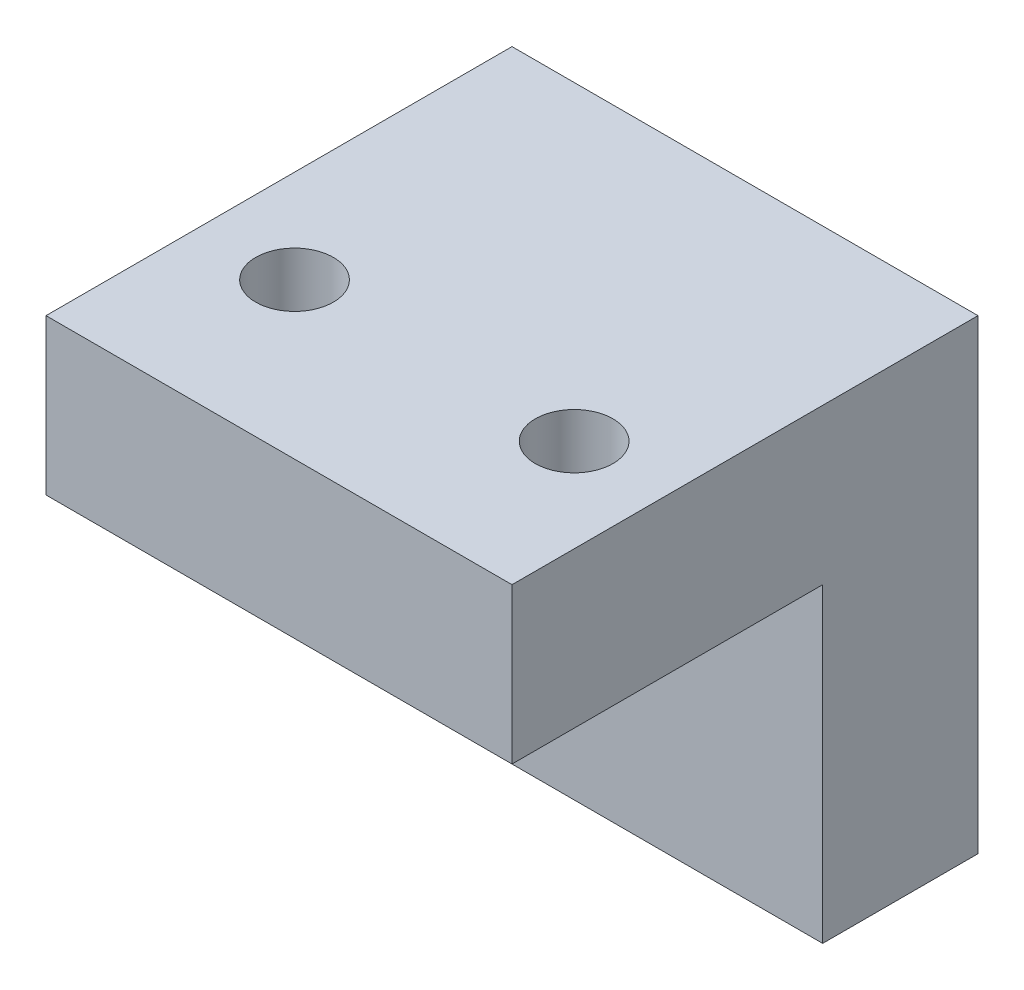
ISO-10303-21;
HEADER;
FILE_DESCRIPTION(('STEP AP214'),'2;1');
FILE_NAME('part.step','',(''),(''),'','','');
FILE_SCHEMA(('AUTOMOTIVE_DESIGN { 1 0 10303 214 1 1 1 1 }'));
ENDSEC;
DATA;
#1=APPLICATION_CONTEXT('core data for automotive mechanical design processes');
#2=APPLICATION_PROTOCOL_DEFINITION('international standard','automotive_design',2000,#1);
#3=PRODUCT_CONTEXT('',#1,'mechanical');
#4=PRODUCT('Part','Part','',(#3));
#5=PRODUCT_RELATED_PRODUCT_CATEGORY('part','',(#4));
#6=PRODUCT_DEFINITION_FORMATION('','',#4);
#7=PRODUCT_DEFINITION_CONTEXT('part definition',#1,'design');
#8=PRODUCT_DEFINITION('design','',#6,#7);
#9=PRODUCT_DEFINITION_SHAPE('','',#8);
#10=(LENGTH_UNIT() NAMED_UNIT(*) SI_UNIT(.MILLI.,.METRE.));
#11=(NAMED_UNIT(*) PLANE_ANGLE_UNIT() SI_UNIT($,.RADIAN.));
#12=(NAMED_UNIT(*) SI_UNIT($,.STERADIAN.) SOLID_ANGLE_UNIT());
#13=UNCERTAINTY_MEASURE_WITH_UNIT(LENGTH_MEASURE(1.E-05),#10,'distance_accuracy_value','');
#14=(GEOMETRIC_REPRESENTATION_CONTEXT(3) GLOBAL_UNCERTAINTY_ASSIGNED_CONTEXT((#13)) GLOBAL_UNIT_ASSIGNED_CONTEXT((#10,
#11,#12)) REPRESENTATION_CONTEXT('',''));
#15=CARTESIAN_POINT('',(0.,0.,0.));
#16=DIRECTION('',(0.,0.,1.));
#17=DIRECTION('',(1.,0.,0.));
#18=AXIS2_PLACEMENT_3D('',#15,#16,#17);
#19=CARTESIAN_POINT('',(0.,10.,0.));
#20=DIRECTION('',(1.,0.,0.));
#21=DIRECTION('',(0.,0.,-1.));
#22=AXIS2_PLACEMENT_3D('',#19,#20,#21);
#23=PLANE('',#22);
#24=DIRECTION('',(0.,0.,1.));
#25=VECTOR('',#24,1.);
#26=CARTESIAN_POINT('',(0.,0.,0.));
#27=LINE('',#26,#25);
#28=CARTESIAN_POINT('',(0.,0.,-5.));
#29=VERTEX_POINT('',#28);
#30=CARTESIAN_POINT('',(0.,0.,0.));
#31=VERTEX_POINT('',#30);
#32=EDGE_CURVE('E98',#29,#31,#27,.T.);
#33=ORIENTED_EDGE('',*,*,#32,.T.);
#34=DIRECTION('',(0.,-1.,0.));
#35=VECTOR('',#34,1.);
#36=CARTESIAN_POINT('',(0.,10.,0.));
#37=LINE('',#36,#35);
#38=CARTESIAN_POINT('',(0.,10.,0.));
#39=VERTEX_POINT('',#38);
#40=EDGE_CURVE('E11',#39,#31,#37,.T.);
#41=ORIENTED_EDGE('',*,*,#40,.F.);
#42=DIRECTION('',(0.,0.,1.));
#43=VECTOR('',#42,1.);
#44=CARTESIAN_POINT('',(0.,10.,-5.));
#45=LINE('',#44,#43);
#46=CARTESIAN_POINT('',(0.,10.,10.));
#47=VERTEX_POINT('',#46);
#48=EDGE_CURVE('E123',#39,#47,#45,.T.);
#49=ORIENTED_EDGE('',*,*,#48,.T.);
#50=DIRECTION('',(0.,-1.,0.));
#51=VECTOR('',#50,1.);
#52=CARTESIAN_POINT('',(0.,15.,10.));
#53=LINE('',#52,#51);
#54=CARTESIAN_POINT('',(0.,15.,10.));
#55=VERTEX_POINT('',#54);
#56=EDGE_CURVE('E118',#55,#47,#53,.T.);
#57=ORIENTED_EDGE('',*,*,#56,.F.);
#58=DIRECTION('',(0.,0.,1.));
#59=VECTOR('',#58,1.);
#60=CARTESIAN_POINT('',(0.,15.,-5.));
#61=LINE('',#60,#59);
#62=CARTESIAN_POINT('',(0.,15.,-5.));
#63=VERTEX_POINT('',#62);
#64=EDGE_CURVE('E107',#63,#55,#61,.T.);
#65=ORIENTED_EDGE('',*,*,#64,.F.);
#66=DIRECTION('',(0.,-1.,0.));
#67=VECTOR('',#66,1.);
#68=CARTESIAN_POINT('',(0.,10.,-5.));
#69=LINE('',#68,#67);
#70=EDGE_CURVE('E91',#63,#29,#69,.T.);
#71=ORIENTED_EDGE('',*,*,#70,.T.);
#72=EDGE_LOOP('',(#33,#41,#49,#57,#65,#71));
#73=FACE_BOUND('',#72,.T.);
#74=ADVANCED_FACE('F41',(#73),#23,.F.);
#75=CARTESIAN_POINT('',(0.,10.,0.));
#76=DIRECTION('',(0.,0.,-1.));
#77=DIRECTION('',(-1.,0.,0.));
#78=AXIS2_PLACEMENT_3D('',#75,#76,#77);
#79=PLANE('',#78);
#80=CARTESIAN_POINT('',(7.5,5.,0.));
#81=DIRECTION('',(0.,0.,1.));
#82=DIRECTION('',(1.,0.,0.));
#83=AXIS2_PLACEMENT_3D('',#80,#81,#82);
#84=CIRCLE('',#83,1.25);
#85=CARTESIAN_POINT('',(8.75,5.,0.));
#86=VERTEX_POINT('',#85);
#87=EDGE_CURVE('E152',#86,#86,#84,.T.);
#88=ORIENTED_EDGE('',*,*,#87,.F.);
#89=EDGE_LOOP('',(#88));
#90=FACE_BOUND('',#89,.T.);
#91=DIRECTION('',(1.,0.,0.));
#92=VECTOR('',#91,1.);
#93=CARTESIAN_POINT('',(0.,0.,0.));
#94=LINE('',#93,#92);
#95=CARTESIAN_POINT('',(15.,0.,0.));
#96=VERTEX_POINT('',#95);
#97=EDGE_CURVE('E83',#31,#96,#94,.T.);
#98=ORIENTED_EDGE('',*,*,#97,.T.);
#99=DIRECTION('',(0.,-1.,0.));
#100=VECTOR('',#99,1.);
#101=CARTESIAN_POINT('',(15.,10.,0.));
#102=LINE('',#101,#100);
#103=CARTESIAN_POINT('',(15.,10.,0.));
#104=VERTEX_POINT('',#103);
#105=EDGE_CURVE('E47',#104,#96,#102,.T.);
#106=ORIENTED_EDGE('',*,*,#105,.F.);
#107=DIRECTION('',(1.,0.,0.));
#108=VECTOR('',#107,1.);
#109=CARTESIAN_POINT('',(0.,10.,0.));
#110=LINE('',#109,#108);
#111=EDGE_CURVE('E54',#39,#104,#110,.T.);
#112=ORIENTED_EDGE('',*,*,#111,.F.);
#113=ORIENTED_EDGE('',*,*,#40,.T.);
#114=EDGE_LOOP('',(#98,#106,#112,#113));
#115=FACE_BOUND('',#114,.T.);
#116=ADVANCED_FACE('F131',(#90,#115),#79,.F.);
#117=CARTESIAN_POINT('',(15.,10.,0.));
#118=DIRECTION('',(-1.,0.,0.));
#119=DIRECTION('',(0.,0.,1.));
#120=AXIS2_PLACEMENT_3D('',#117,#118,#119);
#121=PLANE('',#120);
#122=DIRECTION('',(0.,0.,-1.));
#123=VECTOR('',#122,1.);
#124=CARTESIAN_POINT('',(15.,0.,0.));
#125=LINE('',#124,#123);
#126=CARTESIAN_POINT('',(15.,0.,-5.));
#127=VERTEX_POINT('',#126);
#128=EDGE_CURVE('E71',#96,#127,#125,.T.);
#129=ORIENTED_EDGE('',*,*,#128,.T.);
#130=DIRECTION('',(0.,-1.,0.));
#131=VECTOR('',#130,1.);
#132=CARTESIAN_POINT('',(15.,10.,-5.));
#133=LINE('',#132,#131);
#134=CARTESIAN_POINT('',(15.,15.,-5.));
#135=VERTEX_POINT('',#134);
#136=EDGE_CURVE('E78',#135,#127,#133,.T.);
#137=ORIENTED_EDGE('',*,*,#136,.F.);
#138=DIRECTION('',(0.,0.,-1.));
#139=VECTOR('',#138,1.);
#140=CARTESIAN_POINT('',(15.,15.,-5.));
#141=LINE('',#140,#139);
#142=CARTESIAN_POINT('',(15.,15.,10.));
#143=VERTEX_POINT('',#142);
#144=EDGE_CURVE('E111',#143,#135,#141,.T.);
#145=ORIENTED_EDGE('',*,*,#144,.F.);
#146=DIRECTION('',(0.,-1.,0.));
#147=VECTOR('',#146,1.);
#148=CARTESIAN_POINT('',(15.,15.,10.));
#149=LINE('',#148,#147);
#150=CARTESIAN_POINT('',(15.,10.,10.));
#151=VERTEX_POINT('',#150);
#152=EDGE_CURVE('E113',#143,#151,#149,.T.);
#153=ORIENTED_EDGE('',*,*,#152,.T.);
#154=DIRECTION('',(0.,0.,-1.));
#155=VECTOR('',#154,1.);
#156=CARTESIAN_POINT('',(15.,10.,-5.));
#157=LINE('',#156,#155);
#158=EDGE_CURVE('E132',#151,#104,#157,.T.);
#159=ORIENTED_EDGE('',*,*,#158,.T.);
#160=ORIENTED_EDGE('',*,*,#105,.T.);
#161=EDGE_LOOP('',(#129,#137,#145,#153,#159,#160));
#162=FACE_BOUND('',#161,.T.);
#163=ADVANCED_FACE('F73',(#162),#121,.F.);
#164=CARTESIAN_POINT('',(0.,10.,-5.));
#165=DIRECTION('',(0.,0.,1.));
#166=DIRECTION('',(1.,0.,0.));
#167=AXIS2_PLACEMENT_3D('',#164,#165,#166);
#168=PLANE('',#167);
#169=CARTESIAN_POINT('',(7.5,5.,-5.));
#170=DIRECTION('',(0.,0.,1.));
#171=DIRECTION('',(1.,0.,0.));
#172=AXIS2_PLACEMENT_3D('',#169,#170,#171);
#173=CIRCLE('',#172,1.25);
#174=CARTESIAN_POINT('',(8.75,5.,-5.));
#175=VERTEX_POINT('',#174);
#176=EDGE_CURVE('E126',#175,#175,#173,.T.);
#177=ORIENTED_EDGE('',*,*,#176,.T.);
#178=EDGE_LOOP('',(#177));
#179=FACE_BOUND('',#178,.T.);
#180=DIRECTION('',(-1.,0.,0.));
#181=VECTOR('',#180,1.);
#182=CARTESIAN_POINT('',(0.,0.,-5.));
#183=LINE('',#182,#181);
#184=EDGE_CURVE('E82',#127,#29,#183,.T.);
#185=ORIENTED_EDGE('',*,*,#184,.T.);
#186=ORIENTED_EDGE('',*,*,#70,.F.);
#187=DIRECTION('',(-1.,0.,0.));
#188=VECTOR('',#187,1.);
#189=CARTESIAN_POINT('',(0.,15.,-5.));
#190=LINE('',#189,#188);
#191=EDGE_CURVE('E95',#135,#63,#190,.T.);
#192=ORIENTED_EDGE('',*,*,#191,.F.);
#193=ORIENTED_EDGE('',*,*,#136,.T.);
#194=EDGE_LOOP('',(#185,#186,#192,#193));
#195=FACE_BOUND('',#194,.T.);
#196=ADVANCED_FACE('F86',(#179,#195),#168,.F.);
#197=CARTESIAN_POINT('',(0.,0.,0.));
#198=DIRECTION('',(0.,-1.,0.));
#199=DIRECTION('',(0.,0.,-1.));
#200=AXIS2_PLACEMENT_3D('',#197,#198,#199);
#201=PLANE('',#200);
#202=ORIENTED_EDGE('',*,*,#32,.F.);
#203=ORIENTED_EDGE('',*,*,#184,.F.);
#204=ORIENTED_EDGE('',*,*,#128,.F.);
#205=ORIENTED_EDGE('',*,*,#97,.F.);
#206=EDGE_LOOP('',(#202,#203,#204,#205));
#207=FACE_BOUND('',#206,.T.);
#208=ADVANCED_FACE('F96',(#207),#201,.T.);
#209=CARTESIAN_POINT('',(0.,10.,0.));
#210=DIRECTION('',(0.,1.,0.));
#211=DIRECTION('',(0.,0.,1.));
#212=AXIS2_PLACEMENT_3D('',#209,#210,#211);
#213=PLANE('',#212);
#214=CARTESIAN_POINT('',(3.,10.,5.));
#215=DIRECTION('',(0.,1.,0.));
#216=DIRECTION('',(0.,0.,1.));
#217=AXIS2_PLACEMENT_3D('',#214,#215,#216);
#218=CIRCLE('',#217,1.25);
#219=CARTESIAN_POINT('',(3.,10.,6.25));
#220=VERTEX_POINT('',#219);
#221=EDGE_CURVE('E160',#220,#220,#218,.T.);
#222=ORIENTED_EDGE('',*,*,#221,.T.);
#223=EDGE_LOOP('',(#222));
#224=FACE_BOUND('',#223,.T.);
#225=CARTESIAN_POINT('',(12.,10.,5.));
#226=DIRECTION('',(0.,1.,0.));
#227=DIRECTION('',(0.,0.,1.));
#228=AXIS2_PLACEMENT_3D('',#225,#226,#227);
#229=CIRCLE('',#228,1.25);
#230=CARTESIAN_POINT('',(12.,10.,6.25));
#231=VERTEX_POINT('',#230);
#232=EDGE_CURVE('E162',#231,#231,#229,.T.);
#233=ORIENTED_EDGE('',*,*,#232,.T.);
#234=EDGE_LOOP('',(#233));
#235=FACE_BOUND('',#234,.T.);
#236=ORIENTED_EDGE('',*,*,#48,.F.);
#237=ORIENTED_EDGE('',*,*,#111,.T.);
#238=ORIENTED_EDGE('',*,*,#158,.F.);
#239=DIRECTION('',(1.,0.,0.));
#240=VECTOR('',#239,1.);
#241=CARTESIAN_POINT('',(0.,10.,10.));
#242=LINE('',#241,#240);
#243=EDGE_CURVE('E130',#47,#151,#242,.T.);
#244=ORIENTED_EDGE('',*,*,#243,.F.);
#245=EDGE_LOOP('',(#236,#237,#238,#244));
#246=FACE_BOUND('',#245,.T.);
#247=ADVANCED_FACE('F139',(#224,#235,#246),#213,.F.);
#248=CARTESIAN_POINT('',(0.,15.,10.));
#249=DIRECTION('',(0.,0.,-1.));
#250=DIRECTION('',(-1.,0.,0.));
#251=AXIS2_PLACEMENT_3D('',#248,#249,#250);
#252=PLANE('',#251);
#253=ORIENTED_EDGE('',*,*,#243,.T.);
#254=ORIENTED_EDGE('',*,*,#152,.F.);
#255=DIRECTION('',(1.,0.,0.));
#256=VECTOR('',#255,1.);
#257=CARTESIAN_POINT('',(0.,15.,10.));
#258=LINE('',#257,#256);
#259=EDGE_CURVE('E116',#55,#143,#258,.T.);
#260=ORIENTED_EDGE('',*,*,#259,.F.);
#261=ORIENTED_EDGE('',*,*,#56,.T.);
#262=EDGE_LOOP('',(#253,#254,#260,#261));
#263=FACE_BOUND('',#262,.T.);
#264=ADVANCED_FACE('F150',(#263),#252,.F.);
#265=CARTESIAN_POINT('',(0.,15.,0.));
#266=DIRECTION('',(0.,1.,0.));
#267=DIRECTION('',(0.,0.,1.));
#268=AXIS2_PLACEMENT_3D('',#265,#266,#267);
#269=PLANE('',#268);
#270=CARTESIAN_POINT('',(3.,15.,5.));
#271=DIRECTION('',(0.,1.,0.));
#272=DIRECTION('',(0.,0.,1.));
#273=AXIS2_PLACEMENT_3D('',#270,#271,#272);
#274=CIRCLE('',#273,1.25);
#275=CARTESIAN_POINT('',(3.,15.,6.25));
#276=VERTEX_POINT('',#275);
#277=EDGE_CURVE('E167',#276,#276,#274,.T.);
#278=ORIENTED_EDGE('',*,*,#277,.F.);
#279=EDGE_LOOP('',(#278));
#280=FACE_BOUND('',#279,.T.);
#281=CARTESIAN_POINT('',(12.,15.,5.));
#282=DIRECTION('',(0.,1.,0.));
#283=DIRECTION('',(0.,0.,1.));
#284=AXIS2_PLACEMENT_3D('',#281,#282,#283);
#285=CIRCLE('',#284,1.25);
#286=CARTESIAN_POINT('',(12.,15.,6.25));
#287=VERTEX_POINT('',#286);
#288=EDGE_CURVE('E159',#287,#287,#285,.T.);
#289=ORIENTED_EDGE('',*,*,#288,.F.);
#290=EDGE_LOOP('',(#289));
#291=FACE_BOUND('',#290,.T.);
#292=ORIENTED_EDGE('',*,*,#64,.T.);
#293=ORIENTED_EDGE('',*,*,#259,.T.);
#294=ORIENTED_EDGE('',*,*,#144,.T.);
#295=ORIENTED_EDGE('',*,*,#191,.T.);
#296=EDGE_LOOP('',(#292,#293,#294,#295));
#297=FACE_BOUND('',#296,.T.);
#298=ADVANCED_FACE('F112',(#280,#291,#297),#269,.T.);
#299=CARTESIAN_POINT('',(7.5,5.,-5.));
#300=DIRECTION('',(0.,0.,1.));
#301=DIRECTION('',(1.,0.,0.));
#302=AXIS2_PLACEMENT_3D('',#299,#300,#301);
#303=CYLINDRICAL_SURFACE('',#302,1.25);
#304=ORIENTED_EDGE('',*,*,#176,.F.);
#305=EDGE_LOOP('',(#304));
#306=FACE_BOUND('',#305,.T.);
#307=ORIENTED_EDGE('',*,*,#87,.T.);
#308=EDGE_LOOP('',(#307));
#309=FACE_BOUND('',#308,.T.);
#310=ADVANCED_FACE('F181',(#306,#309),#303,.F.);
#311=CARTESIAN_POINT('',(12.,10.,5.));
#312=DIRECTION('',(0.,1.,0.));
#313=DIRECTION('',(0.,0.,1.));
#314=AXIS2_PLACEMENT_3D('',#311,#312,#313);
#315=CYLINDRICAL_SURFACE('',#314,1.25);
#316=ORIENTED_EDGE('',*,*,#232,.F.);
#317=EDGE_LOOP('',(#316));
#318=FACE_BOUND('',#317,.T.);
#319=ORIENTED_EDGE('',*,*,#288,.T.);
#320=EDGE_LOOP('',(#319));
#321=FACE_BOUND('',#320,.T.);
#322=ADVANCED_FACE('F180',(#318,#321),#315,.F.);
#323=CARTESIAN_POINT('',(3.,10.,5.));
#324=DIRECTION('',(0.,1.,0.));
#325=DIRECTION('',(0.,0.,1.));
#326=AXIS2_PLACEMENT_3D('',#323,#324,#325);
#327=CYLINDRICAL_SURFACE('',#326,1.25);
#328=ORIENTED_EDGE('',*,*,#221,.F.);
#329=EDGE_LOOP('',(#328));
#330=FACE_BOUND('',#329,.T.);
#331=ORIENTED_EDGE('',*,*,#277,.T.);
#332=EDGE_LOOP('',(#331));
#333=FACE_BOUND('',#332,.T.);
#334=ADVANCED_FACE('F174',(#330,#333),#327,.F.);
#335=CLOSED_SHELL('',(#74,#116,#163,#196,#208,#247,#264,#298,#310,#322,#334));
#336=MANIFOLD_SOLID_BREP('B2',#335);
#337=ADVANCED_BREP_SHAPE_REPRESENTATION('',(#18,#336),#14);
#338=SHAPE_DEFINITION_REPRESENTATION(#9,#337);
ENDSEC;
END-ISO-10303-21;
